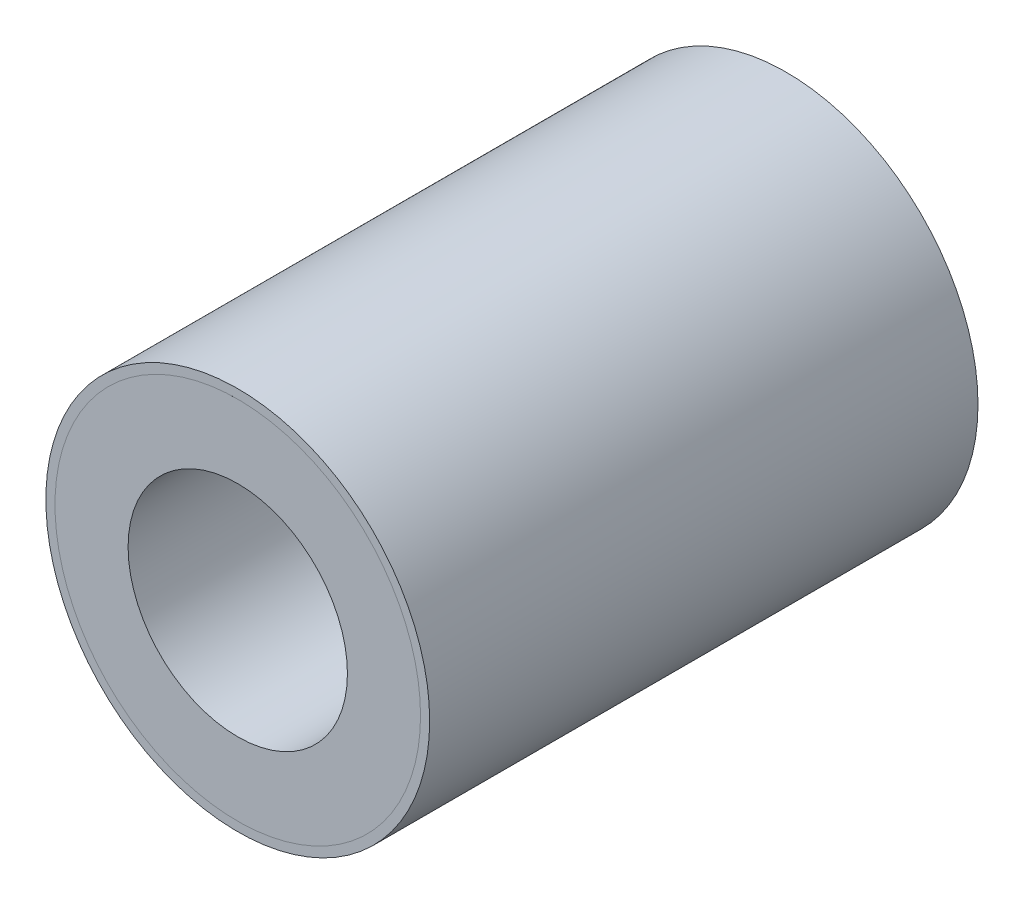
ISO-10303-21;
HEADER;
FILE_DESCRIPTION(('STEP AP214'),'2;1');
FILE_NAME('part.step','',(''),(''),'','','');
FILE_SCHEMA(('AUTOMOTIVE_DESIGN { 1 0 10303 214 1 1 1 1 }'));
ENDSEC;
DATA;
#1=APPLICATION_CONTEXT('core data for automotive mechanical design processes');
#2=APPLICATION_PROTOCOL_DEFINITION('international standard','automotive_design',2000,#1);
#3=PRODUCT_CONTEXT('',#1,'mechanical');
#4=PRODUCT('Part','Part','',(#3));
#5=PRODUCT_RELATED_PRODUCT_CATEGORY('part','',(#4));
#6=PRODUCT_DEFINITION_FORMATION('','',#4);
#7=PRODUCT_DEFINITION_CONTEXT('part definition',#1,'design');
#8=PRODUCT_DEFINITION('design','',#6,#7);
#9=PRODUCT_DEFINITION_SHAPE('','',#8);
#10=(LENGTH_UNIT() NAMED_UNIT(*) SI_UNIT(.MILLI.,.METRE.));
#11=(NAMED_UNIT(*) PLANE_ANGLE_UNIT() SI_UNIT($,.RADIAN.));
#12=(NAMED_UNIT(*) SI_UNIT($,.STERADIAN.) SOLID_ANGLE_UNIT());
#13=UNCERTAINTY_MEASURE_WITH_UNIT(LENGTH_MEASURE(1.E-05),#10,'distance_accuracy_value','');
#14=(GEOMETRIC_REPRESENTATION_CONTEXT(3) GLOBAL_UNCERTAINTY_ASSIGNED_CONTEXT((#13)) GLOBAL_UNIT_ASSIGNED_CONTEXT((#10,
#11,#12)) REPRESENTATION_CONTEXT('',''));
#15=CARTESIAN_POINT('',(0.,0.,0.));
#16=DIRECTION('',(0.,0.,1.));
#17=DIRECTION('',(1.,0.,0.));
#18=AXIS2_PLACEMENT_3D('',#15,#16,#17);
#19=CARTESIAN_POINT('',(-2.22044604925031E-13,0.,30.));
#20=DIRECTION('',(0.,0.,-1.));
#21=DIRECTION('',(-1.,0.,0.));
#22=AXIS2_PLACEMENT_3D('',#19,#20,#21);
#23=CYLINDRICAL_SURFACE('',#22,10.);
#24=CARTESIAN_POINT('',(-2.22044604925031E-13,0.,30.));
#25=DIRECTION('',(0.,0.,1.));
#26=DIRECTION('',(1.,0.,0.));
#27=AXIS2_PLACEMENT_3D('',#24,#25,#26);
#28=CIRCLE('',#27,10.);
#29=CARTESIAN_POINT('',(9.99999999999978,0.,30.));
#30=VERTEX_POINT('',#29);
#31=EDGE_CURVE('E59',#30,#30,#28,.T.);
#32=ORIENTED_EDGE('',*,*,#31,.T.);
#33=EDGE_LOOP('',(#32));
#34=FACE_BOUND('',#33,.T.);
#35=CARTESIAN_POINT('',(0.,0.,0.));
#36=DIRECTION('',(0.,0.,1.));
#37=DIRECTION('',(1.,0.,0.));
#38=AXIS2_PLACEMENT_3D('',#35,#36,#37);
#39=CIRCLE('',#38,10.);
#40=CARTESIAN_POINT('',(10.,0.,0.));
#41=VERTEX_POINT('',#40);
#42=EDGE_CURVE('E67',#41,#41,#39,.T.);
#43=ORIENTED_EDGE('',*,*,#42,.F.);
#44=EDGE_LOOP('',(#43));
#45=FACE_BOUND('',#44,.T.);
#46=ADVANCED_FACE('F51',(#34,#45),#23,.F.);
#47=CARTESIAN_POINT('',(-2.22044604925031E-13,0.,30.));
#48=DIRECTION('',(0.,0.,-1.));
#49=DIRECTION('',(-1.,0.,0.));
#50=AXIS2_PLACEMENT_3D('',#47,#48,#49);
#51=CYLINDRICAL_SURFACE('',#50,10.5);
#52=CARTESIAN_POINT('',(-2.22044604925031E-13,0.,30.));
#53=DIRECTION('',(0.,0.,1.));
#54=DIRECTION('',(1.,0.,0.));
#55=AXIS2_PLACEMENT_3D('',#52,#53,#54);
#56=CIRCLE('',#55,10.5);
#57=CARTESIAN_POINT('',(10.4999999999998,0.,30.));
#58=VERTEX_POINT('',#57);
#59=EDGE_CURVE('E11',#58,#58,#56,.T.);
#60=ORIENTED_EDGE('',*,*,#59,.F.);
#61=EDGE_LOOP('',(#60));
#62=FACE_BOUND('',#61,.T.);
#63=CARTESIAN_POINT('',(0.,0.,0.));
#64=DIRECTION('',(0.,0.,1.));
#65=DIRECTION('',(1.,0.,0.));
#66=AXIS2_PLACEMENT_3D('',#63,#64,#65);
#67=CIRCLE('',#66,10.5);
#68=CARTESIAN_POINT('',(10.5,0.,0.));
#69=VERTEX_POINT('',#68);
#70=EDGE_CURVE('E54',#69,#69,#67,.T.);
#71=ORIENTED_EDGE('',*,*,#70,.T.);
#72=EDGE_LOOP('',(#71));
#73=FACE_BOUND('',#72,.T.);
#74=ADVANCED_FACE('F78',(#62,#73),#51,.T.);
#75=CARTESIAN_POINT('',(-2.22044604925031E-13,0.,30.));
#76=DIRECTION('',(0.,0.,1.));
#77=DIRECTION('',(1.,0.,0.));
#78=AXIS2_PLACEMENT_3D('',#75,#76,#77);
#79=PLANE('',#78);
#80=ORIENTED_EDGE('',*,*,#31,.F.);
#81=EDGE_LOOP('',(#80));
#82=FACE_BOUND('',#81,.T.);
#83=ORIENTED_EDGE('',*,*,#59,.T.);
#84=EDGE_LOOP('',(#83));
#85=FACE_BOUND('',#84,.T.);
#86=ADVANCED_FACE('F82',(#82,#85),#79,.T.);
#87=CARTESIAN_POINT('',(0.,0.,0.));
#88=DIRECTION('',(0.,0.,1.));
#89=DIRECTION('',(1.,0.,0.));
#90=AXIS2_PLACEMENT_3D('',#87,#88,#89);
#91=PLANE('',#90);
#92=ORIENTED_EDGE('',*,*,#42,.T.);
#93=EDGE_LOOP('',(#92));
#94=FACE_BOUND('',#93,.T.);
#95=ORIENTED_EDGE('',*,*,#70,.F.);
#96=EDGE_LOOP('',(#95));
#97=FACE_BOUND('',#96,.T.);
#98=ADVANCED_FACE('F80',(#94,#97),#91,.F.);
#99=CLOSED_SHELL('',(#46,#74,#86,#98));
#100=MANIFOLD_SOLID_BREP('B2',#99);
#101=CARTESIAN_POINT('',(-2.22044604925031E-13,0.,30.));
#102=DIRECTION('',(0.,0.,-1.));
#103=DIRECTION('',(-1.,0.,0.));
#104=AXIS2_PLACEMENT_3D('',#101,#102,#103);
#105=CYLINDRICAL_SURFACE('',#104,6.);
#106=CARTESIAN_POINT('',(-2.22044604925031E-13,0.,30.));
#107=DIRECTION('',(0.,0.,1.));
#108=DIRECTION('',(1.,0.,0.));
#109=AXIS2_PLACEMENT_3D('',#106,#107,#108);
#110=CIRCLE('',#109,6.);
#111=CARTESIAN_POINT('',(5.99999999999978,0.,30.));
#112=VERTEX_POINT('',#111);
#113=EDGE_CURVE('E129',#112,#112,#110,.T.);
#114=ORIENTED_EDGE('',*,*,#113,.T.);
#115=EDGE_LOOP('',(#114));
#116=FACE_BOUND('',#115,.T.);
#117=CARTESIAN_POINT('',(0.,0.,0.));
#118=DIRECTION('',(0.,0.,1.));
#119=DIRECTION('',(1.,0.,0.));
#120=AXIS2_PLACEMENT_3D('',#117,#118,#119);
#121=CIRCLE('',#120,6.);
#122=CARTESIAN_POINT('',(6.,0.,0.));
#123=VERTEX_POINT('',#122);
#124=EDGE_CURVE('E137',#123,#123,#121,.T.);
#125=ORIENTED_EDGE('',*,*,#124,.F.);
#126=EDGE_LOOP('',(#125));
#127=FACE_BOUND('',#126,.T.);
#128=ADVANCED_FACE('F121',(#116,#127),#105,.F.);
#129=CARTESIAN_POINT('',(-2.22044604925031E-13,0.,30.));
#130=DIRECTION('',(0.,0.,-1.));
#131=DIRECTION('',(-1.,0.,0.));
#132=AXIS2_PLACEMENT_3D('',#129,#130,#131);
#133=CYLINDRICAL_SURFACE('',#132,10.);
#134=CARTESIAN_POINT('',(-2.22044604925031E-13,0.,30.));
#135=DIRECTION('',(0.,0.,1.));
#136=DIRECTION('',(1.,0.,0.));
#137=AXIS2_PLACEMENT_3D('',#134,#135,#136);
#138=CIRCLE('',#137,10.);
#139=CARTESIAN_POINT('',(9.99999999999978,0.,30.));
#140=VERTEX_POINT('',#139);
#141=EDGE_CURVE('E50',#140,#140,#138,.T.);
#142=ORIENTED_EDGE('',*,*,#141,.F.);
#143=EDGE_LOOP('',(#142));
#144=FACE_BOUND('',#143,.T.);
#145=CARTESIAN_POINT('',(0.,0.,0.));
#146=DIRECTION('',(0.,0.,1.));
#147=DIRECTION('',(1.,0.,0.));
#148=AXIS2_PLACEMENT_3D('',#145,#146,#147);
#149=CIRCLE('',#148,10.);
#150=CARTESIAN_POINT('',(10.,0.,0.));
#151=VERTEX_POINT('',#150);
#152=EDGE_CURVE('E124',#151,#151,#149,.T.);
#153=ORIENTED_EDGE('',*,*,#152,.T.);
#154=EDGE_LOOP('',(#153));
#155=FACE_BOUND('',#154,.T.);
#156=ADVANCED_FACE('F148',(#144,#155),#133,.T.);
#157=CARTESIAN_POINT('',(-2.22044604925031E-13,0.,30.));
#158=DIRECTION('',(0.,0.,1.));
#159=DIRECTION('',(1.,0.,0.));
#160=AXIS2_PLACEMENT_3D('',#157,#158,#159);
#161=PLANE('',#160);
#162=ORIENTED_EDGE('',*,*,#113,.F.);
#163=EDGE_LOOP('',(#162));
#164=FACE_BOUND('',#163,.T.);
#165=ORIENTED_EDGE('',*,*,#141,.T.);
#166=EDGE_LOOP('',(#165));
#167=FACE_BOUND('',#166,.T.);
#168=ADVANCED_FACE('F152',(#164,#167),#161,.T.);
#169=CARTESIAN_POINT('',(0.,0.,0.));
#170=DIRECTION('',(0.,0.,1.));
#171=DIRECTION('',(1.,0.,0.));
#172=AXIS2_PLACEMENT_3D('',#169,#170,#171);
#173=PLANE('',#172);
#174=ORIENTED_EDGE('',*,*,#124,.T.);
#175=EDGE_LOOP('',(#174));
#176=FACE_BOUND('',#175,.T.);
#177=ORIENTED_EDGE('',*,*,#152,.F.);
#178=EDGE_LOOP('',(#177));
#179=FACE_BOUND('',#178,.T.);
#180=ADVANCED_FACE('F150',(#176,#179),#173,.F.);
#181=CLOSED_SHELL('',(#128,#156,#168,#180));
#182=MANIFOLD_SOLID_BREP('B6',#181);
#183=ADVANCED_BREP_SHAPE_REPRESENTATION('',(#18,#100,#182),#14);
#184=SHAPE_DEFINITION_REPRESENTATION(#9,#183);
ENDSEC;
END-ISO-10303-21;
